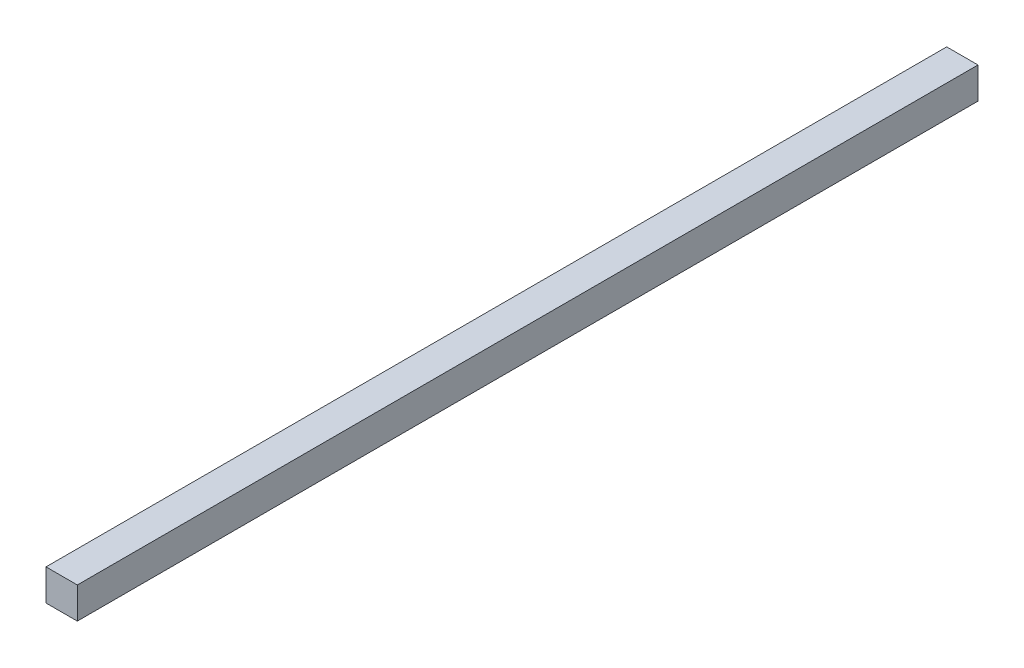
ISO-10303-21;
HEADER;
FILE_DESCRIPTION(('STEP AP214'),'2;1');
FILE_NAME('part.step','',(''),(''),'','','');
FILE_SCHEMA(('AUTOMOTIVE_DESIGN { 1 0 10303 214 1 1 1 1 }'));
ENDSEC;
DATA;
#1=APPLICATION_CONTEXT('core data for automotive mechanical design processes');
#2=APPLICATION_PROTOCOL_DEFINITION('international standard','automotive_design',2000,#1);
#3=PRODUCT_CONTEXT('',#1,'mechanical');
#4=PRODUCT('Part','Part','',(#3));
#5=PRODUCT_RELATED_PRODUCT_CATEGORY('part','',(#4));
#6=PRODUCT_DEFINITION_FORMATION('','',#4);
#7=PRODUCT_DEFINITION_CONTEXT('part definition',#1,'design');
#8=PRODUCT_DEFINITION('design','',#6,#7);
#9=PRODUCT_DEFINITION_SHAPE('','',#8);
#10=(LENGTH_UNIT() NAMED_UNIT(*) SI_UNIT(.MILLI.,.METRE.));
#11=(NAMED_UNIT(*) PLANE_ANGLE_UNIT() SI_UNIT($,.RADIAN.));
#12=(NAMED_UNIT(*) SI_UNIT($,.STERADIAN.) SOLID_ANGLE_UNIT());
#13=UNCERTAINTY_MEASURE_WITH_UNIT(LENGTH_MEASURE(1.E-05),#10,'distance_accuracy_value','');
#14=(GEOMETRIC_REPRESENTATION_CONTEXT(3) GLOBAL_UNCERTAINTY_ASSIGNED_CONTEXT((#13)) GLOBAL_UNIT_ASSIGNED_CONTEXT((#10,
#11,#12)) REPRESENTATION_CONTEXT('',''));
#15=CARTESIAN_POINT('',(0.,0.,0.));
#16=DIRECTION('',(0.,0.,1.));
#17=DIRECTION('',(1.,0.,0.));
#18=AXIS2_PLACEMENT_3D('',#15,#16,#17);
#19=CARTESIAN_POINT('',(10.,-10.,575.));
#20=DIRECTION('',(-1.,0.,0.));
#21=DIRECTION('',(0.,0.,1.));
#22=AXIS2_PLACEMENT_3D('',#19,#20,#21);
#23=PLANE('',#22);
#24=DIRECTION('',(0.,1.,0.));
#25=VECTOR('',#24,1.);
#26=CARTESIAN_POINT('',(10.,-10.,0.));
#27=LINE('',#26,#25);
#28=CARTESIAN_POINT('',(10.,-10.,0.));
#29=VERTEX_POINT('',#28);
#30=CARTESIAN_POINT('',(10.,10.,0.));
#31=VERTEX_POINT('',#30);
#32=EDGE_CURVE('E97',#29,#31,#27,.T.);
#33=ORIENTED_EDGE('',*,*,#32,.T.);
#34=DIRECTION('',(0.,0.,-1.));
#35=VECTOR('',#34,1.);
#36=CARTESIAN_POINT('',(10.,10.,575.));
#37=LINE('',#36,#35);
#38=CARTESIAN_POINT('',(10.,10.,575.));
#39=VERTEX_POINT('',#38);
#40=EDGE_CURVE('E11',#39,#31,#37,.T.);
#41=ORIENTED_EDGE('',*,*,#40,.F.);
#42=DIRECTION('',(0.,1.,0.));
#43=VECTOR('',#42,1.);
#44=CARTESIAN_POINT('',(10.,-10.,575.));
#45=LINE('',#44,#43);
#46=CARTESIAN_POINT('',(10.,-10.,575.));
#47=VERTEX_POINT('',#46);
#48=EDGE_CURVE('E85',#47,#39,#45,.T.);
#49=ORIENTED_EDGE('',*,*,#48,.F.);
#50=DIRECTION('',(0.,0.,-1.));
#51=VECTOR('',#50,1.);
#52=CARTESIAN_POINT('',(10.,-10.,575.));
#53=LINE('',#52,#51);
#54=EDGE_CURVE('E93',#47,#29,#53,.T.);
#55=ORIENTED_EDGE('',*,*,#54,.T.);
#56=EDGE_LOOP('',(#33,#41,#49,#55));
#57=FACE_BOUND('',#56,.T.);
#58=ADVANCED_FACE('F34',(#57),#23,.F.);
#59=CARTESIAN_POINT('',(-10.,10.,575.));
#60=DIRECTION('',(0.,-1.,0.));
#61=DIRECTION('',(0.,0.,-1.));
#62=AXIS2_PLACEMENT_3D('',#59,#60,#61);
#63=PLANE('',#62);
#64=DIRECTION('',(-1.,0.,0.));
#65=VECTOR('',#64,1.);
#66=CARTESIAN_POINT('',(-10.,10.,0.));
#67=LINE('',#66,#65);
#68=CARTESIAN_POINT('',(-10.,10.,0.));
#69=VERTEX_POINT('',#68);
#70=EDGE_CURVE('E89',#31,#69,#67,.T.);
#71=ORIENTED_EDGE('',*,*,#70,.T.);
#72=DIRECTION('',(0.,0.,-1.));
#73=VECTOR('',#72,1.);
#74=CARTESIAN_POINT('',(-10.,10.,575.));
#75=LINE('',#74,#73);
#76=CARTESIAN_POINT('',(-10.,10.,575.));
#77=VERTEX_POINT('',#76);
#78=EDGE_CURVE('E42',#77,#69,#75,.T.);
#79=ORIENTED_EDGE('',*,*,#78,.F.);
#80=DIRECTION('',(-1.,0.,0.));
#81=VECTOR('',#80,1.);
#82=CARTESIAN_POINT('',(-10.,10.,575.));
#83=LINE('',#82,#81);
#84=EDGE_CURVE('E80',#39,#77,#83,.T.);
#85=ORIENTED_EDGE('',*,*,#84,.F.);
#86=ORIENTED_EDGE('',*,*,#40,.T.);
#87=EDGE_LOOP('',(#71,#79,#85,#86));
#88=FACE_BOUND('',#87,.T.);
#89=ADVANCED_FACE('F88',(#88),#63,.F.);
#90=CARTESIAN_POINT('',(-10.,-10.,575.));
#91=DIRECTION('',(1.,0.,0.));
#92=DIRECTION('',(0.,0.,-1.));
#93=AXIS2_PLACEMENT_3D('',#90,#91,#92);
#94=PLANE('',#93);
#95=DIRECTION('',(0.,-1.,0.));
#96=VECTOR('',#95,1.);
#97=CARTESIAN_POINT('',(-10.,-10.,0.));
#98=LINE('',#97,#96);
#99=CARTESIAN_POINT('',(-10.,-10.,0.));
#100=VERTEX_POINT('',#99);
#101=EDGE_CURVE('E67',#69,#100,#98,.T.);
#102=ORIENTED_EDGE('',*,*,#101,.T.);
#103=DIRECTION('',(0.,0.,-1.));
#104=VECTOR('',#103,1.);
#105=CARTESIAN_POINT('',(-10.,-10.,575.));
#106=LINE('',#105,#104);
#107=CARTESIAN_POINT('',(-10.,-10.,575.));
#108=VERTEX_POINT('',#107);
#109=EDGE_CURVE('E90',#108,#100,#106,.T.);
#110=ORIENTED_EDGE('',*,*,#109,.F.);
#111=DIRECTION('',(0.,-1.,0.));
#112=VECTOR('',#111,1.);
#113=CARTESIAN_POINT('',(-10.,-10.,575.));
#114=LINE('',#113,#112);
#115=EDGE_CURVE('E83',#77,#108,#114,.T.);
#116=ORIENTED_EDGE('',*,*,#115,.F.);
#117=ORIENTED_EDGE('',*,*,#78,.T.);
#118=EDGE_LOOP('',(#102,#110,#116,#117));
#119=FACE_BOUND('',#118,.T.);
#120=ADVANCED_FACE('F91',(#119),#94,.F.);
#121=CARTESIAN_POINT('',(-10.,-10.,575.));
#122=DIRECTION('',(0.,1.,0.));
#123=DIRECTION('',(0.,0.,1.));
#124=AXIS2_PLACEMENT_3D('',#121,#122,#123);
#125=PLANE('',#124);
#126=DIRECTION('',(1.,0.,0.));
#127=VECTOR('',#126,1.);
#128=CARTESIAN_POINT('',(-10.,-10.,0.));
#129=LINE('',#128,#127);
#130=EDGE_CURVE('E73',#100,#29,#129,.T.);
#131=ORIENTED_EDGE('',*,*,#130,.T.);
#132=ORIENTED_EDGE('',*,*,#54,.F.);
#133=DIRECTION('',(1.,0.,0.));
#134=VECTOR('',#133,1.);
#135=CARTESIAN_POINT('',(-10.,-10.,575.));
#136=LINE('',#135,#134);
#137=EDGE_CURVE('E50',#108,#47,#136,.T.);
#138=ORIENTED_EDGE('',*,*,#137,.F.);
#139=ORIENTED_EDGE('',*,*,#109,.T.);
#140=EDGE_LOOP('',(#131,#132,#138,#139));
#141=FACE_BOUND('',#140,.T.);
#142=ADVANCED_FACE('F104',(#141),#125,.F.);
#143=CARTESIAN_POINT('',(0.,0.,575.));
#144=DIRECTION('',(0.,0.,-1.));
#145=DIRECTION('',(-1.,0.,0.));
#146=AXIS2_PLACEMENT_3D('',#143,#144,#145);
#147=PLANE('',#146);
#148=ORIENTED_EDGE('',*,*,#48,.T.);
#149=ORIENTED_EDGE('',*,*,#84,.T.);
#150=ORIENTED_EDGE('',*,*,#115,.T.);
#151=ORIENTED_EDGE('',*,*,#137,.T.);
#152=EDGE_LOOP('',(#148,#149,#150,#151));
#153=FACE_BOUND('',#152,.T.);
#154=ADVANCED_FACE('F81',(#153),#147,.F.);
#155=CARTESIAN_POINT('',(0.,0.,0.));
#156=DIRECTION('',(0.,0.,-1.));
#157=DIRECTION('',(-1.,0.,0.));
#158=AXIS2_PLACEMENT_3D('',#155,#156,#157);
#159=PLANE('',#158);
#160=ORIENTED_EDGE('',*,*,#32,.F.);
#161=ORIENTED_EDGE('',*,*,#130,.F.);
#162=ORIENTED_EDGE('',*,*,#101,.F.);
#163=ORIENTED_EDGE('',*,*,#70,.F.);
#164=EDGE_LOOP('',(#160,#161,#162,#163));
#165=FACE_BOUND('',#164,.T.);
#166=ADVANCED_FACE('F107',(#165),#159,.T.);
#167=CLOSED_SHELL('',(#58,#89,#120,#142,#154,#166));
#168=MANIFOLD_SOLID_BREP('B2',#167);
#169=ADVANCED_BREP_SHAPE_REPRESENTATION('',(#18,#168),#14);
#170=SHAPE_DEFINITION_REPRESENTATION(#9,#169);
ENDSEC;
END-ISO-10303-21;
